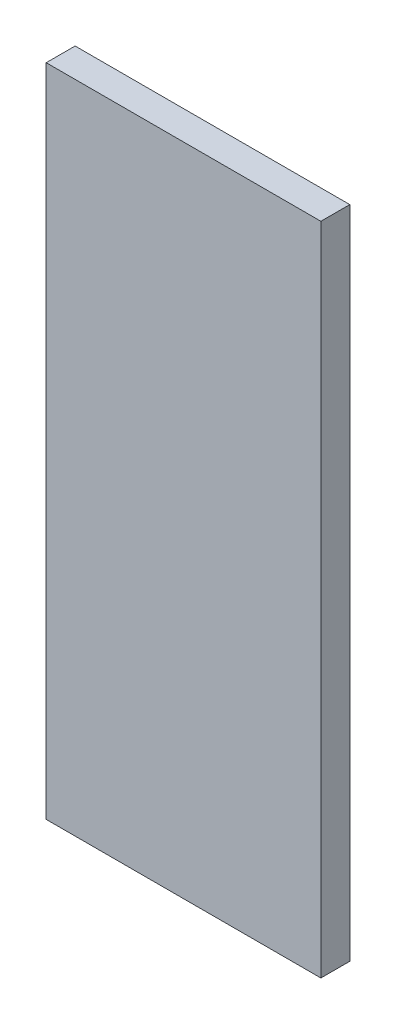
ISO-10303-21;
HEADER;
FILE_DESCRIPTION(('STEP AP214'),'2;1');
FILE_NAME('part.step','',(''),(''),'','','');
FILE_SCHEMA(('AUTOMOTIVE_DESIGN { 1 0 10303 214 1 1 1 1 }'));
ENDSEC;
DATA;
#1=APPLICATION_CONTEXT('core data for automotive mechanical design processes');
#2=APPLICATION_PROTOCOL_DEFINITION('international standard','automotive_design',2000,#1);
#3=PRODUCT_CONTEXT('',#1,'mechanical');
#4=PRODUCT('Part','Part','',(#3));
#5=PRODUCT_RELATED_PRODUCT_CATEGORY('part','',(#4));
#6=PRODUCT_DEFINITION_FORMATION('','',#4);
#7=PRODUCT_DEFINITION_CONTEXT('part definition',#1,'design');
#8=PRODUCT_DEFINITION('design','',#6,#7);
#9=PRODUCT_DEFINITION_SHAPE('','',#8);
#10=(LENGTH_UNIT() NAMED_UNIT(*) SI_UNIT(.MILLI.,.METRE.));
#11=(NAMED_UNIT(*) PLANE_ANGLE_UNIT() SI_UNIT($,.RADIAN.));
#12=(NAMED_UNIT(*) SI_UNIT($,.STERADIAN.) SOLID_ANGLE_UNIT());
#13=UNCERTAINTY_MEASURE_WITH_UNIT(LENGTH_MEASURE(1.E-05),#10,'distance_accuracy_value','');
#14=(GEOMETRIC_REPRESENTATION_CONTEXT(3) GLOBAL_UNCERTAINTY_ASSIGNED_CONTEXT((#13)) GLOBAL_UNIT_ASSIGNED_CONTEXT((#10,
#11,#12)) REPRESENTATION_CONTEXT('',''));
#15=CARTESIAN_POINT('',(0.,0.,0.));
#16=DIRECTION('',(0.,0.,1.));
#17=DIRECTION('',(1.,0.,0.));
#18=AXIS2_PLACEMENT_3D('',#15,#16,#17);
#19=CARTESIAN_POINT('',(361.95,-863.6,76.2));
#20=DIRECTION('',(-1.,0.,0.));
#21=DIRECTION('',(0.,0.,1.));
#22=AXIS2_PLACEMENT_3D('',#19,#20,#21);
#23=PLANE('',#22);
#24=DIRECTION('',(0.,1.,0.));
#25=VECTOR('',#24,1.);
#26=CARTESIAN_POINT('',(361.95,-863.6,0.));
#27=LINE('',#26,#25);
#28=CARTESIAN_POINT('',(361.95,-863.6,0.));
#29=VERTEX_POINT('',#28);
#30=CARTESIAN_POINT('',(361.95,863.6,0.));
#31=VERTEX_POINT('',#30);
#32=EDGE_CURVE('E107',#29,#31,#27,.T.);
#33=ORIENTED_EDGE('',*,*,#32,.T.);
#34=DIRECTION('',(0.,0.,-1.));
#35=VECTOR('',#34,1.);
#36=CARTESIAN_POINT('',(361.95,863.6,76.2));
#37=LINE('',#36,#35);
#38=CARTESIAN_POINT('',(361.95,863.6,76.2));
#39=VERTEX_POINT('',#38);
#40=EDGE_CURVE('E11',#39,#31,#37,.T.);
#41=ORIENTED_EDGE('',*,*,#40,.F.);
#42=DIRECTION('',(0.,1.,0.));
#43=VECTOR('',#42,1.);
#44=CARTESIAN_POINT('',(361.95,-863.6,76.2));
#45=LINE('',#44,#43);
#46=CARTESIAN_POINT('',(361.95,-863.6,76.2));
#47=VERTEX_POINT('',#46);
#48=EDGE_CURVE('E91',#47,#39,#45,.T.);
#49=ORIENTED_EDGE('',*,*,#48,.F.);
#50=DIRECTION('',(0.,0.,-1.));
#51=VECTOR('',#50,1.);
#52=CARTESIAN_POINT('',(361.95,-863.6,76.2));
#53=LINE('',#52,#51);
#54=EDGE_CURVE('E103',#47,#29,#53,.T.);
#55=ORIENTED_EDGE('',*,*,#54,.T.);
#56=EDGE_LOOP('',(#33,#41,#49,#55));
#57=FACE_BOUND('',#56,.T.);
#58=ADVANCED_FACE('F39',(#57),#23,.F.);
#59=CARTESIAN_POINT('',(-361.95,863.6,76.2));
#60=DIRECTION('',(0.,-1.,0.));
#61=DIRECTION('',(0.,0.,-1.));
#62=AXIS2_PLACEMENT_3D('',#59,#60,#61);
#63=PLANE('',#62);
#64=DIRECTION('',(-1.,0.,0.));
#65=VECTOR('',#64,1.);
#66=CARTESIAN_POINT('',(-361.95,863.6,0.));
#67=LINE('',#66,#65);
#68=CARTESIAN_POINT('',(-361.95,863.6,0.));
#69=VERTEX_POINT('',#68);
#70=EDGE_CURVE('E96',#31,#69,#67,.T.);
#71=ORIENTED_EDGE('',*,*,#70,.T.);
#72=DIRECTION('',(0.,0.,-1.));
#73=VECTOR('',#72,1.);
#74=CARTESIAN_POINT('',(-361.95,863.6,76.2));
#75=LINE('',#74,#73);
#76=CARTESIAN_POINT('',(-361.95,863.6,76.2));
#77=VERTEX_POINT('',#76);
#78=EDGE_CURVE('E48',#77,#69,#75,.T.);
#79=ORIENTED_EDGE('',*,*,#78,.F.);
#80=DIRECTION('',(-1.,0.,0.));
#81=VECTOR('',#80,1.);
#82=CARTESIAN_POINT('',(-361.95,863.6,76.2));
#83=LINE('',#82,#81);
#84=EDGE_CURVE('E86',#39,#77,#83,.T.);
#85=ORIENTED_EDGE('',*,*,#84,.F.);
#86=ORIENTED_EDGE('',*,*,#40,.T.);
#87=EDGE_LOOP('',(#71,#79,#85,#86));
#88=FACE_BOUND('',#87,.T.);
#89=ADVANCED_FACE('F95',(#88),#63,.F.);
#90=CARTESIAN_POINT('',(-361.95,-863.6,76.2));
#91=DIRECTION('',(1.,0.,0.));
#92=DIRECTION('',(0.,0.,-1.));
#93=AXIS2_PLACEMENT_3D('',#90,#91,#92);
#94=PLANE('',#93);
#95=DIRECTION('',(0.,-1.,0.));
#96=VECTOR('',#95,1.);
#97=CARTESIAN_POINT('',(-361.95,-863.6,0.));
#98=LINE('',#97,#96);
#99=CARTESIAN_POINT('',(-361.95,-863.6,0.));
#100=VERTEX_POINT('',#99);
#101=EDGE_CURVE('E73',#69,#100,#98,.T.);
#102=ORIENTED_EDGE('',*,*,#101,.T.);
#103=DIRECTION('',(0.,0.,-1.));
#104=VECTOR('',#103,1.);
#105=CARTESIAN_POINT('',(-361.95,-863.6,76.2));
#106=LINE('',#105,#104);
#107=CARTESIAN_POINT('',(-361.95,-863.6,76.2));
#108=VERTEX_POINT('',#107);
#109=EDGE_CURVE('E98',#108,#100,#106,.T.);
#110=ORIENTED_EDGE('',*,*,#109,.F.);
#111=DIRECTION('',(0.,-1.,0.));
#112=VECTOR('',#111,1.);
#113=CARTESIAN_POINT('',(-361.95,-863.6,76.2));
#114=LINE('',#113,#112);
#115=EDGE_CURVE('E89',#77,#108,#114,.T.);
#116=ORIENTED_EDGE('',*,*,#115,.F.);
#117=ORIENTED_EDGE('',*,*,#78,.T.);
#118=EDGE_LOOP('',(#102,#110,#116,#117));
#119=FACE_BOUND('',#118,.T.);
#120=ADVANCED_FACE('F99',(#119),#94,.F.);
#121=CARTESIAN_POINT('',(-361.95,-863.6,76.2));
#122=DIRECTION('',(0.,1.,0.));
#123=DIRECTION('',(0.,0.,1.));
#124=AXIS2_PLACEMENT_3D('',#121,#122,#123);
#125=PLANE('',#124);
#126=DIRECTION('',(1.,0.,0.));
#127=VECTOR('',#126,1.);
#128=CARTESIAN_POINT('',(-361.95,-863.6,0.));
#129=LINE('',#128,#127);
#130=EDGE_CURVE('E79',#100,#29,#129,.T.);
#131=ORIENTED_EDGE('',*,*,#130,.T.);
#132=ORIENTED_EDGE('',*,*,#54,.F.);
#133=DIRECTION('',(1.,0.,0.));
#134=VECTOR('',#133,1.);
#135=CARTESIAN_POINT('',(-361.95,-863.6,76.2));
#136=LINE('',#135,#134);
#137=EDGE_CURVE('E56',#108,#47,#136,.T.);
#138=ORIENTED_EDGE('',*,*,#137,.F.);
#139=ORIENTED_EDGE('',*,*,#109,.T.);
#140=EDGE_LOOP('',(#131,#132,#138,#139));
#141=FACE_BOUND('',#140,.T.);
#142=ADVANCED_FACE('F120',(#141),#125,.F.);
#143=CARTESIAN_POINT('',(0.,0.,76.2));
#144=DIRECTION('',(0.,0.,-1.));
#145=DIRECTION('',(-1.,0.,0.));
#146=AXIS2_PLACEMENT_3D('',#143,#144,#145);
#147=PLANE('',#146);
#148=ORIENTED_EDGE('',*,*,#48,.T.);
#149=ORIENTED_EDGE('',*,*,#84,.T.);
#150=ORIENTED_EDGE('',*,*,#115,.T.);
#151=ORIENTED_EDGE('',*,*,#137,.T.);
#152=EDGE_LOOP('',(#148,#149,#150,#151));
#153=FACE_BOUND('',#152,.T.);
#154=ADVANCED_FACE('F87',(#153),#147,.F.);
#155=CARTESIAN_POINT('',(0.,0.,0.));
#156=DIRECTION('',(0.,0.,-1.));
#157=DIRECTION('',(-1.,0.,0.));
#158=AXIS2_PLACEMENT_3D('',#155,#156,#157);
#159=PLANE('',#158);
#160=ORIENTED_EDGE('',*,*,#32,.F.);
#161=ORIENTED_EDGE('',*,*,#130,.F.);
#162=ORIENTED_EDGE('',*,*,#101,.F.);
#163=ORIENTED_EDGE('',*,*,#70,.F.);
#164=EDGE_LOOP('',(#160,#161,#162,#163));
#165=FACE_BOUND('',#164,.T.);
#166=ADVANCED_FACE('F123',(#165),#159,.T.);
#167=CLOSED_SHELL('',(#58,#89,#120,#142,#154,#166));
#168=MANIFOLD_SOLID_BREP('B2',#167);
#169=ADVANCED_BREP_SHAPE_REPRESENTATION('',(#18,#168),#14);
#170=SHAPE_DEFINITION_REPRESENTATION(#9,#169);
ENDSEC;
END-ISO-10303-21;
